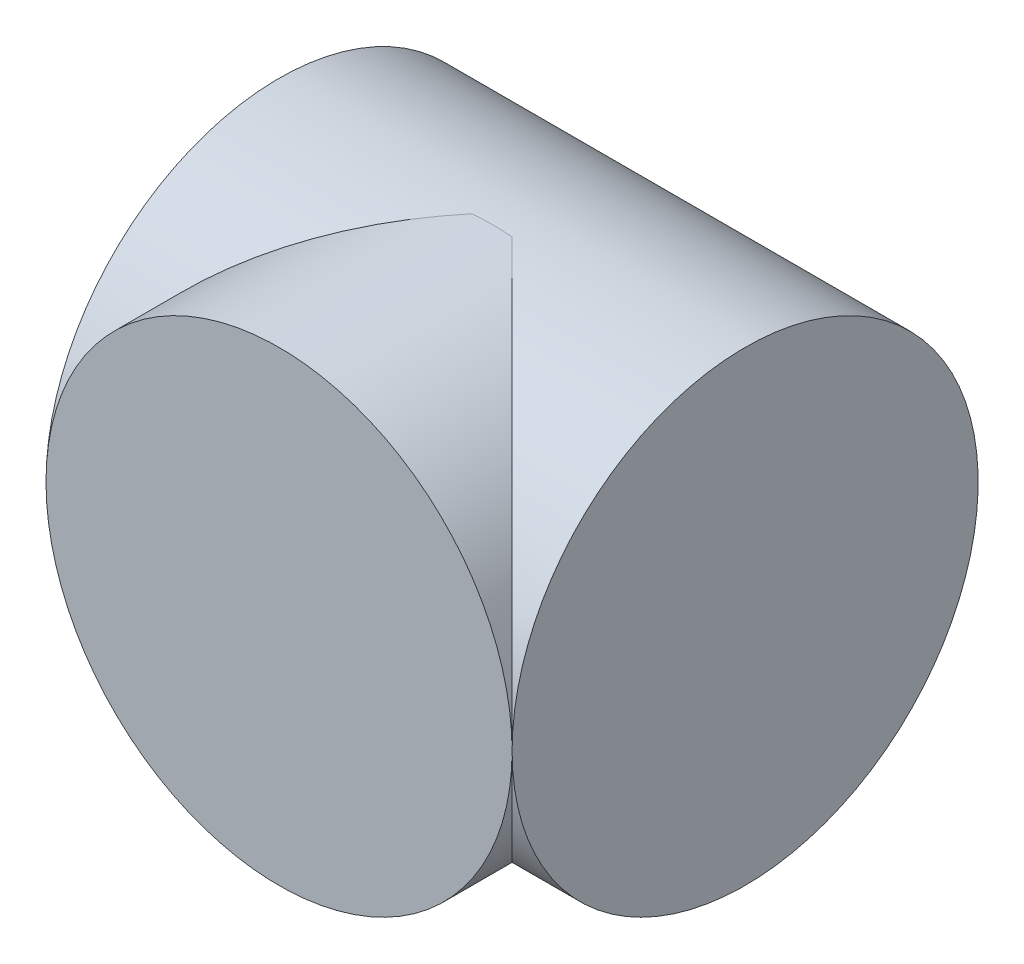
ISO-10303-21;
HEADER;
FILE_DESCRIPTION(('STEP AP214'),'2;1');
FILE_NAME('part.step','',(''),(''),'','','');
FILE_SCHEMA(('AUTOMOTIVE_DESIGN { 1 0 10303 214 1 1 1 1 }'));
ENDSEC;
DATA;
#1=APPLICATION_CONTEXT('core data for automotive mechanical design processes');
#2=APPLICATION_PROTOCOL_DEFINITION('international standard','automotive_design',2000,#1);
#3=PRODUCT_CONTEXT('',#1,'mechanical');
#4=PRODUCT('Part','Part','',(#3));
#5=PRODUCT_RELATED_PRODUCT_CATEGORY('part','',(#4));
#6=PRODUCT_DEFINITION_FORMATION('','',#4);
#7=PRODUCT_DEFINITION_CONTEXT('part definition',#1,'design');
#8=PRODUCT_DEFINITION('design','',#6,#7);
#9=PRODUCT_DEFINITION_SHAPE('','',#8);
#10=(LENGTH_UNIT() NAMED_UNIT(*) SI_UNIT(.MILLI.,.METRE.));
#11=(NAMED_UNIT(*) PLANE_ANGLE_UNIT() SI_UNIT($,.RADIAN.));
#12=(NAMED_UNIT(*) SI_UNIT($,.STERADIAN.) SOLID_ANGLE_UNIT());
#13=UNCERTAINTY_MEASURE_WITH_UNIT(LENGTH_MEASURE(1.E-05),#10,'distance_accuracy_value','');
#14=(GEOMETRIC_REPRESENTATION_CONTEXT(3) GLOBAL_UNCERTAINTY_ASSIGNED_CONTEXT((#13)) GLOBAL_UNIT_ASSIGNED_CONTEXT((#10,
#11,#12)) REPRESENTATION_CONTEXT('',''));
#15=CARTESIAN_POINT('',(0.,0.,0.));
#16=DIRECTION('',(0.,0.,1.));
#17=DIRECTION('',(1.,0.,0.));
#18=AXIS2_PLACEMENT_3D('',#15,#16,#17);
#19=CARTESIAN_POINT('',(70.,0.,0.));
#20=DIRECTION('',(-1.,0.,0.));
#21=DIRECTION('',(0.,0.,1.));
#22=AXIS2_PLACEMENT_3D('',#19,#20,#21);
#23=CYLINDRICAL_SURFACE('',#22,35.);
#24=DIRECTION('',(-1.,0.,0.));
#25=VECTOR('',#24,1.);
#26=CARTESIAN_POINT('',(70.,34.8711915483254,2.99999999999999));
#27=LINE('',#26,#25);
#28=CARTESIAN_POINT('',(38.0000000000002,34.8711915483254,2.99999999999999));
#29=VERTEX_POINT('',#28);
#30=CARTESIAN_POINT('',(32.,34.8711915483254,2.99999999999999));
#31=VERTEX_POINT('',#30);
#32=EDGE_CURVE('E50',#29,#31,#27,.T.);
#33=ORIENTED_EDGE('',*,*,#32,.F.);
#34=CARTESIAN_POINT('',(35.,0.,0.));
#35=DIRECTION('',(-0.707106781186547,0.,0.707106781186547));
#36=DIRECTION('',(-0.707106781186547,0.,-0.707106781186547));
#37=AXIS2_PLACEMENT_3D('',#34,#35,#36);
#38=ELLIPSE('',#37,49.4974746830583,35.);
#39=CARTESIAN_POINT('',(70.,0.,35.));
#40=VERTEX_POINT('',#39);
#41=EDGE_CURVE('E76',#29,#40,#38,.F.);
#42=ORIENTED_EDGE('',*,*,#41,.T.);
#43=CARTESIAN_POINT('',(70.,0.,0.));
#44=DIRECTION('',(1.,0.,0.));
#45=DIRECTION('',(0.,0.,-1.));
#46=AXIS2_PLACEMENT_3D('',#43,#44,#45);
#47=CIRCLE('',#46,35.);
#48=EDGE_CURVE('E11',#40,#40,#47,.T.);
#49=ORIENTED_EDGE('',*,*,#48,.F.);
#50=CARTESIAN_POINT('',(38.0000000000002,-34.8711915483254,2.99999999999999));
#51=VERTEX_POINT('',#50);
#52=EDGE_CURVE('E68',#40,#51,#38,.F.);
#53=ORIENTED_EDGE('',*,*,#52,.T.);
#54=DIRECTION('',(-1.,0.,0.));
#55=VECTOR('',#54,1.);
#56=CARTESIAN_POINT('',(70.,-34.8711915483254,2.99999999999999));
#57=LINE('',#56,#55);
#58=CARTESIAN_POINT('',(31.9999999999998,-34.8711915483254,2.99999999999999));
#59=VERTEX_POINT('',#58);
#60=EDGE_CURVE('E57',#59,#51,#57,.F.);
#61=ORIENTED_EDGE('',*,*,#60,.F.);
#62=CARTESIAN_POINT('',(35.,0.,0.));
#63=DIRECTION('',(-0.707106781186547,0.,-0.707106781186547));
#64=DIRECTION('',(-0.707106781186547,0.,0.707106781186547));
#65=AXIS2_PLACEMENT_3D('',#62,#63,#64);
#66=ELLIPSE('',#65,49.4974746830583,35.);
#67=CARTESIAN_POINT('',(0.,0.,35.));
#68=VERTEX_POINT('',#67);
#69=EDGE_CURVE('E73',#59,#68,#66,.T.);
#70=ORIENTED_EDGE('',*,*,#69,.T.);
#71=CARTESIAN_POINT('',(0.,0.,0.));
#72=DIRECTION('',(1.,0.,0.));
#73=DIRECTION('',(0.,0.,-1.));
#74=AXIS2_PLACEMENT_3D('',#71,#72,#73);
#75=CIRCLE('',#74,35.);
#76=EDGE_CURVE('E39',#68,#68,#75,.T.);
#77=ORIENTED_EDGE('',*,*,#76,.T.);
#78=EDGE_CURVE('E74',#68,#31,#66,.T.);
#79=ORIENTED_EDGE('',*,*,#78,.T.);
#80=EDGE_LOOP('',(#33,#42,#49,#53,#61,#70,#77,#79));
#81=FACE_BOUND('',#80,.T.);
#82=ADVANCED_FACE('F36',(#81),#23,.T.);
#83=CARTESIAN_POINT('',(70.,0.,0.));
#84=DIRECTION('',(1.,0.,0.));
#85=DIRECTION('',(0.,0.,-1.));
#86=AXIS2_PLACEMENT_3D('',#83,#84,#85);
#87=PLANE('',#86);
#88=ORIENTED_EDGE('',*,*,#48,.T.);
#89=EDGE_LOOP('',(#88));
#90=FACE_BOUND('',#89,.T.);
#91=ADVANCED_FACE('F112',(#90),#87,.T.);
#92=CARTESIAN_POINT('',(0.,0.,0.));
#93=DIRECTION('',(1.,0.,0.));
#94=DIRECTION('',(0.,0.,-1.));
#95=AXIS2_PLACEMENT_3D('',#92,#93,#94);
#96=PLANE('',#95);
#97=ORIENTED_EDGE('',*,*,#76,.F.);
#98=EDGE_LOOP('',(#97));
#99=FACE_BOUND('',#98,.T.);
#100=ADVANCED_FACE('F96',(#99),#96,.F.);
#101=CARTESIAN_POINT('',(35.,0.,2.99999999999999));
#102=DIRECTION('',(0.,0.,1.));
#103=DIRECTION('',(1.,0.,0.));
#104=AXIS2_PLACEMENT_3D('',#101,#102,#103);
#105=CYLINDRICAL_SURFACE('',#104,35.);
#106=ORIENTED_EDGE('',*,*,#41,.F.);
#107=CARTESIAN_POINT('',(35.,0.,2.99999999999999));
#108=DIRECTION('',(0.,0.,1.));
#109=DIRECTION('',(1.,0.,0.));
#110=AXIS2_PLACEMENT_3D('',#107,#108,#109);
#111=CIRCLE('',#110,35.);
#112=EDGE_CURVE('E81',#29,#31,#111,.T.);
#113=ORIENTED_EDGE('',*,*,#112,.T.);
#114=ORIENTED_EDGE('',*,*,#78,.F.);
#115=CARTESIAN_POINT('',(35.,0.,35.));
#116=DIRECTION('',(0.,0.,1.));
#117=DIRECTION('',(1.,0.,0.));
#118=AXIS2_PLACEMENT_3D('',#115,#116,#117);
#119=CIRCLE('',#118,35.);
#120=EDGE_CURVE('E84',#40,#68,#119,.T.);
#121=ORIENTED_EDGE('',*,*,#120,.F.);
#122=EDGE_LOOP('',(#106,#113,#114,#121));
#123=FACE_BOUND('',#122,.T.);
#124=ADVANCED_FACE('F99',(#123),#105,.T.);
#125=ORIENTED_EDGE('',*,*,#69,.F.);
#126=EDGE_CURVE('E80',#59,#51,#111,.T.);
#127=ORIENTED_EDGE('',*,*,#126,.T.);
#128=ORIENTED_EDGE('',*,*,#52,.F.);
#129=EDGE_CURVE('E88',#68,#40,#119,.T.);
#130=ORIENTED_EDGE('',*,*,#129,.F.);
#131=EDGE_LOOP('',(#125,#127,#128,#130));
#132=FACE_BOUND('',#131,.T.);
#133=ADVANCED_FACE('F83',(#132),#105,.T.);
#134=CARTESIAN_POINT('',(0.,0.,2.99999999999999));
#135=DIRECTION('',(0.,0.,1.));
#136=DIRECTION('',(1.,0.,0.));
#137=AXIS2_PLACEMENT_3D('',#134,#135,#136);
#138=PLANE('',#137);
#139=ORIENTED_EDGE('',*,*,#112,.F.);
#140=ORIENTED_EDGE('',*,*,#32,.T.);
#141=EDGE_LOOP('',(#139,#140));
#142=FACE_BOUND('',#141,.T.);
#143=ADVANCED_FACE('F108',(#142),#138,.F.);
#144=ORIENTED_EDGE('',*,*,#126,.F.);
#145=ORIENTED_EDGE('',*,*,#60,.T.);
#146=EDGE_LOOP('',(#144,#145));
#147=FACE_BOUND('',#146,.T.);
#148=ADVANCED_FACE('F79',(#147),#138,.F.);
#149=CARTESIAN_POINT('',(0.,0.,35.));
#150=DIRECTION('',(0.,0.,1.));
#151=DIRECTION('',(1.,0.,0.));
#152=AXIS2_PLACEMENT_3D('',#149,#150,#151);
#153=PLANE('',#152);
#154=ORIENTED_EDGE('',*,*,#120,.T.);
#155=ORIENTED_EDGE('',*,*,#129,.T.);
#156=EDGE_LOOP('',(#154,#155));
#157=FACE_BOUND('',#156,.T.);
#158=ADVANCED_FACE('F102',(#157),#153,.T.);
#159=CLOSED_SHELL('',(#82,#91,#100,#124,#133,#143,#148,#158));
#160=MANIFOLD_SOLID_BREP('B2',#159);
#161=ADVANCED_BREP_SHAPE_REPRESENTATION('',(#18,#160),#14);
#162=SHAPE_DEFINITION_REPRESENTATION(#9,#161);
ENDSEC;
END-ISO-10303-21;
